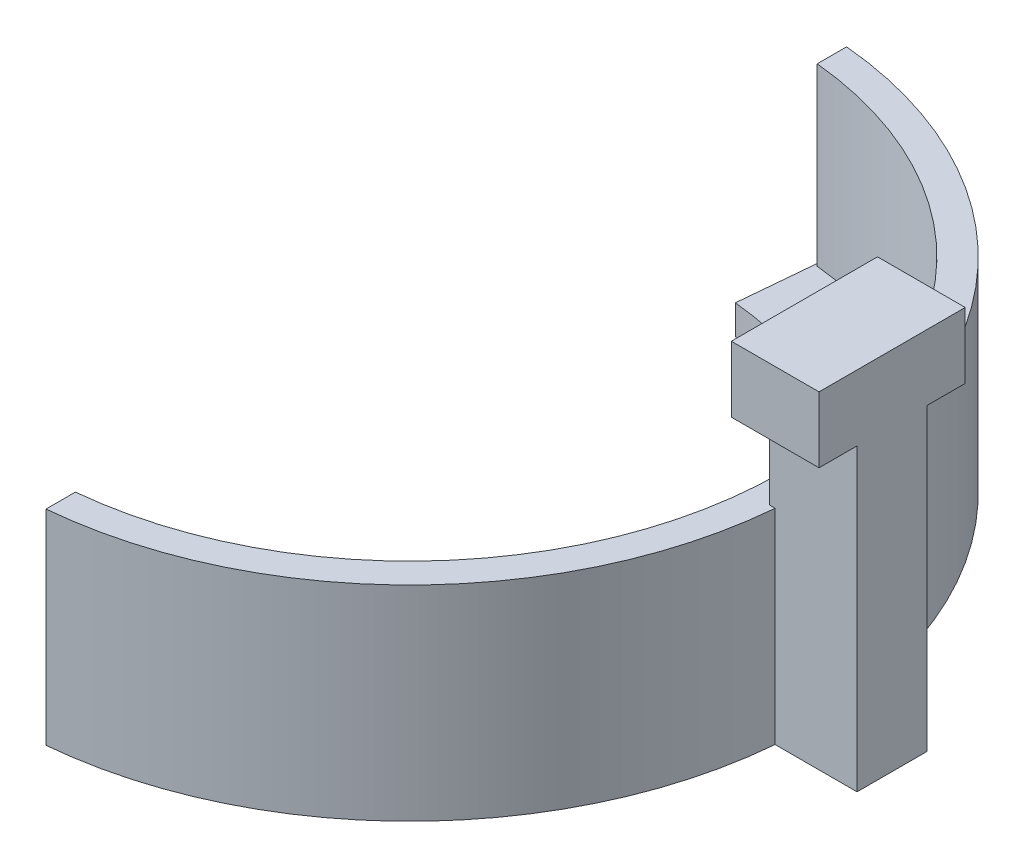
ISO-10303-21;
HEADER;
FILE_DESCRIPTION(('STEP AP214'),'2;1');
FILE_NAME('part.step','',(''),(''),'','','');
FILE_SCHEMA(('AUTOMOTIVE_DESIGN { 1 0 10303 214 1 1 1 1 }'));
ENDSEC;
DATA;
#1=APPLICATION_CONTEXT('core data for automotive mechanical design processes');
#2=APPLICATION_PROTOCOL_DEFINITION('international standard','automotive_design',2000,#1);
#3=PRODUCT_CONTEXT('',#1,'mechanical');
#4=PRODUCT('Part','Part','',(#3));
#5=PRODUCT_RELATED_PRODUCT_CATEGORY('part','',(#4));
#6=PRODUCT_DEFINITION_FORMATION('','',#4);
#7=PRODUCT_DEFINITION_CONTEXT('part definition',#1,'design');
#8=PRODUCT_DEFINITION('design','',#6,#7);
#9=PRODUCT_DEFINITION_SHAPE('','',#8);
#10=(LENGTH_UNIT() NAMED_UNIT(*) SI_UNIT(.MILLI.,.METRE.));
#11=(NAMED_UNIT(*) PLANE_ANGLE_UNIT() SI_UNIT($,.RADIAN.));
#12=(NAMED_UNIT(*) SI_UNIT($,.STERADIAN.) SOLID_ANGLE_UNIT());
#13=UNCERTAINTY_MEASURE_WITH_UNIT(LENGTH_MEASURE(1.E-05),#10,'distance_accuracy_value','');
#14=(GEOMETRIC_REPRESENTATION_CONTEXT(3) GLOBAL_UNCERTAINTY_ASSIGNED_CONTEXT((#13)) GLOBAL_UNIT_ASSIGNED_CONTEXT((#10,
#11,#12)) REPRESENTATION_CONTEXT('',''));
#15=CARTESIAN_POINT('',(0.,0.,0.));
#16=DIRECTION('',(0.,0.,1.));
#17=DIRECTION('',(1.,0.,0.));
#18=AXIS2_PLACEMENT_3D('',#15,#16,#17);
#19=CARTESIAN_POINT('',(27.,20.,-2.4));
#20=DIRECTION('',(0.,0.,-1.));
#21=DIRECTION('',(-1.,0.,0.));
#22=AXIS2_PLACEMENT_3D('',#19,#20,#21);
#23=PLANE('',#22);
#24=DIRECTION('',(0.,-1.,0.));
#25=VECTOR('',#24,1.);
#26=CARTESIAN_POINT('',(27.,20.,-2.4));
#27=LINE('',#26,#25);
#28=CARTESIAN_POINT('',(27.,18.5,-2.4));
#29=VERTEX_POINT('',#28);
#30=CARTESIAN_POINT('',(27.,12.,-2.4));
#31=VERTEX_POINT('',#30);
#32=EDGE_CURVE('E57',#29,#31,#27,.T.);
#33=ORIENTED_EDGE('',*,*,#32,.F.);
#34=DIRECTION('',(1.,0.,0.));
#35=VECTOR('',#34,1.);
#36=CARTESIAN_POINT('',(27.,18.5,-2.4));
#37=LINE('',#36,#35);
#38=CARTESIAN_POINT('',(33.,18.5,-2.4));
#39=VERTEX_POINT('',#38);
#40=EDGE_CURVE('E224',#29,#39,#37,.T.);
#41=ORIENTED_EDGE('',*,*,#40,.T.);
#42=DIRECTION('',(0.,-1.,0.));
#43=VECTOR('',#42,1.);
#44=CARTESIAN_POINT('',(33.,20.,-2.4));
#45=LINE('',#44,#43);
#46=CARTESIAN_POINT('',(33.,-2.,-2.4));
#47=VERTEX_POINT('',#46);
#48=EDGE_CURVE('E241',#39,#47,#45,.T.);
#49=ORIENTED_EDGE('',*,*,#48,.T.);
#50=DIRECTION('',(1.,0.,0.));
#51=VECTOR('',#50,1.);
#52=CARTESIAN_POINT('',(27.,-2.,-2.4));
#53=LINE('',#52,#51);
#54=CARTESIAN_POINT('',(27.3950725496393,-2.,-2.4));
#55=VERTEX_POINT('',#54);
#56=EDGE_CURVE('E236',#55,#47,#53,.T.);
#57=ORIENTED_EDGE('',*,*,#56,.F.);
#58=DIRECTION('',(0.,-1.,0.));
#59=VECTOR('',#58,1.);
#60=CARTESIAN_POINT('',(27.3950725496393,12.,-2.4));
#61=LINE('',#60,#59);
#62=CARTESIAN_POINT('',(27.3950725496393,12.,-2.4));
#63=VERTEX_POINT('',#62);
#64=EDGE_CURVE('E264',#63,#55,#61,.T.);
#65=ORIENTED_EDGE('',*,*,#64,.F.);
#66=DIRECTION('',(-1.,0.,0.));
#67=VECTOR('',#66,1.);
#68=CARTESIAN_POINT('',(0.,12.,-2.4));
#69=LINE('',#68,#67);
#70=EDGE_CURVE('E260',#63,#31,#69,.T.);
#71=ORIENTED_EDGE('',*,*,#70,.T.);
#72=EDGE_LOOP('',(#33,#41,#49,#57,#65,#71));
#73=FACE_BOUND('',#72,.T.);
#74=ADVANCED_FACE('F41',(#73),#23,.T.);
#75=CARTESIAN_POINT('',(27.,20.,2.4));
#76=DIRECTION('',(0.,0.,1.));
#77=DIRECTION('',(1.,0.,0.));
#78=AXIS2_PLACEMENT_3D('',#75,#76,#77);
#79=PLANE('',#78);
#80=DIRECTION('',(0.,-1.,0.));
#81=VECTOR('',#80,1.);
#82=CARTESIAN_POINT('',(33.,20.,2.4));
#83=LINE('',#82,#81);
#84=CARTESIAN_POINT('',(33.,18.5,2.4));
#85=VERTEX_POINT('',#84);
#86=CARTESIAN_POINT('',(33.,-2.,2.4));
#87=VERTEX_POINT('',#86);
#88=EDGE_CURVE('E240',#85,#87,#83,.T.);
#89=ORIENTED_EDGE('',*,*,#88,.F.);
#90=DIRECTION('',(-1.,0.,0.));
#91=VECTOR('',#90,1.);
#92=CARTESIAN_POINT('',(27.,18.5,2.4));
#93=LINE('',#92,#91);
#94=CARTESIAN_POINT('',(27.,18.5,2.4));
#95=VERTEX_POINT('',#94);
#96=EDGE_CURVE('E216',#85,#95,#93,.T.);
#97=ORIENTED_EDGE('',*,*,#96,.T.);
#98=DIRECTION('',(0.,-1.,0.));
#99=VECTOR('',#98,1.);
#100=CARTESIAN_POINT('',(27.,20.,2.4));
#101=LINE('',#100,#99);
#102=CARTESIAN_POINT('',(27.,12.,2.4));
#103=VERTEX_POINT('',#102);
#104=EDGE_CURVE('E65',#95,#103,#101,.T.);
#105=ORIENTED_EDGE('',*,*,#104,.T.);
#106=DIRECTION('',(1.,0.,0.));
#107=VECTOR('',#106,1.);
#108=CARTESIAN_POINT('',(0.,12.,2.4));
#109=LINE('',#108,#107);
#110=CARTESIAN_POINT('',(27.3950725496393,12.,2.4));
#111=VERTEX_POINT('',#110);
#112=EDGE_CURVE('E244',#103,#111,#109,.T.);
#113=ORIENTED_EDGE('',*,*,#112,.T.);
#114=DIRECTION('',(0.,-1.,0.));
#115=VECTOR('',#114,1.);
#116=CARTESIAN_POINT('',(27.3950725496393,12.,2.4));
#117=LINE('',#116,#115);
#118=CARTESIAN_POINT('',(27.3950725496393,-2.,2.4));
#119=VERTEX_POINT('',#118);
#120=EDGE_CURVE('E253',#119,#111,#117,.F.);
#121=ORIENTED_EDGE('',*,*,#120,.F.);
#122=DIRECTION('',(-1.,0.,0.));
#123=VECTOR('',#122,1.);
#124=CARTESIAN_POINT('',(27.,-2.,2.4));
#125=LINE('',#124,#123);
#126=EDGE_CURVE('E232',#87,#119,#125,.T.);
#127=ORIENTED_EDGE('',*,*,#126,.F.);
#128=EDGE_LOOP('',(#89,#97,#105,#113,#121,#127));
#129=FACE_BOUND('',#128,.T.);
#130=ADVANCED_FACE('F380',(#129),#79,.T.);
#131=CARTESIAN_POINT('',(0.,12.,0.));
#132=DIRECTION('',(0.,-1.,0.));
#133=DIRECTION('',(0.,0.,-1.));
#134=AXIS2_PLACEMENT_3D('',#131,#132,#133);
#135=CYLINDRICAL_SURFACE('',#134,27.5);
#136=CARTESIAN_POINT('',(0.,12.,0.));
#137=DIRECTION('',(0.,1.,0.));
#138=DIRECTION('',(0.,0.,1.));
#139=AXIS2_PLACEMENT_3D('',#136,#137,#138);
#140=CIRCLE('',#139,27.5);
#141=CARTESIAN_POINT('',(2.5,12.,-27.3861278752583));
#142=VERTEX_POINT('',#141);
#143=EDGE_CURVE('E313',#63,#142,#140,.T.);
#144=ORIENTED_EDGE('',*,*,#143,.F.);
#145=ORIENTED_EDGE('',*,*,#64,.T.);
#146=CARTESIAN_POINT('',(0.,-2.,0.));
#147=DIRECTION('',(0.,1.,0.));
#148=DIRECTION('',(0.,0.,-1.));
#149=AXIS2_PLACEMENT_3D('',#146,#147,#148);
#150=CIRCLE('',#149,27.5);
#151=CARTESIAN_POINT('',(2.5,-2.,-27.3861278752583));
#152=VERTEX_POINT('',#151);
#153=EDGE_CURVE('E272',#55,#152,#150,.T.);
#154=ORIENTED_EDGE('',*,*,#153,.T.);
#155=DIRECTION('',(0.,1.,0.));
#156=VECTOR('',#155,1.);
#157=CARTESIAN_POINT('',(2.5,-2.,-27.3861278752583));
#158=LINE('',#157,#156);
#159=CARTESIAN_POINT('',(2.5,0.,-27.3861278752583));
#160=VERTEX_POINT('',#159);
#161=EDGE_CURVE('E284',#152,#160,#158,.T.);
#162=ORIENTED_EDGE('',*,*,#161,.T.);
#163=DIRECTION('',(0.,-1.,0.));
#164=VECTOR('',#163,1.);
#165=CARTESIAN_POINT('',(2.5,12.,-27.3861278752583));
#166=LINE('',#165,#164);
#167=EDGE_CURVE('E11',#142,#160,#166,.T.);
#168=ORIENTED_EDGE('',*,*,#167,.F.);
#169=EDGE_LOOP('',(#144,#145,#154,#162,#168));
#170=FACE_BOUND('',#169,.T.);
#171=ADVANCED_FACE('F357',(#170),#135,.T.);
#172=CARTESIAN_POINT('',(2.5,-2.,27.3861278752583));
#173=VERTEX_POINT('',#172);
#174=EDGE_CURVE('E268',#173,#119,#150,.T.);
#175=ORIENTED_EDGE('',*,*,#174,.T.);
#176=ORIENTED_EDGE('',*,*,#120,.T.);
#177=CARTESIAN_POINT('',(2.5,12.,27.3861278752583));
#178=VERTEX_POINT('',#177);
#179=EDGE_CURVE('E309',#178,#111,#140,.T.);
#180=ORIENTED_EDGE('',*,*,#179,.F.);
#181=DIRECTION('',(0.,-1.,0.));
#182=VECTOR('',#181,1.);
#183=CARTESIAN_POINT('',(2.5,12.,27.3861278752583));
#184=LINE('',#183,#182);
#185=CARTESIAN_POINT('',(2.5,0.,27.3861278752583));
#186=VERTEX_POINT('',#185);
#187=EDGE_CURVE('E322',#178,#186,#184,.T.);
#188=ORIENTED_EDGE('',*,*,#187,.T.);
#189=DIRECTION('',(0.,1.,0.));
#190=VECTOR('',#189,1.);
#191=CARTESIAN_POINT('',(2.5,-2.,27.3861278752583));
#192=LINE('',#191,#190);
#193=EDGE_CURVE('E296',#173,#186,#192,.T.);
#194=ORIENTED_EDGE('',*,*,#193,.F.);
#195=EDGE_LOOP('',(#175,#176,#180,#188,#194));
#196=FACE_BOUND('',#195,.T.);
#197=ADVANCED_FACE('F43',(#196),#135,.T.);
#198=CARTESIAN_POINT('',(2.5,12.,-27.3861278752583));
#199=DIRECTION('',(1.,0.,0.));
#200=DIRECTION('',(0.,0.,-1.));
#201=AXIS2_PLACEMENT_3D('',#198,#199,#200);
#202=PLANE('',#201);
#203=DIRECTION('',(0.,0.,1.));
#204=VECTOR('',#203,1.);
#205=CARTESIAN_POINT('',(2.5,0.,-27.3861278752583));
#206=LINE('',#205,#204);
#207=CARTESIAN_POINT('',(2.5,0.,-25.377155080899));
#208=VERTEX_POINT('',#207);
#209=EDGE_CURVE('E299',#160,#208,#206,.T.);
#210=ORIENTED_EDGE('',*,*,#209,.T.);
#211=DIRECTION('',(0.,-1.,0.));
#212=VECTOR('',#211,1.);
#213=CARTESIAN_POINT('',(2.5,12.,-25.377155080899));
#214=LINE('',#213,#212);
#215=CARTESIAN_POINT('',(2.5,12.,-25.377155080899));
#216=VERTEX_POINT('',#215);
#217=EDGE_CURVE('E50',#216,#208,#214,.T.);
#218=ORIENTED_EDGE('',*,*,#217,.F.);
#219=DIRECTION('',(0.,0.,1.));
#220=VECTOR('',#219,1.);
#221=CARTESIAN_POINT('',(2.5,12.,-27.3861278752583));
#222=LINE('',#221,#220);
#223=EDGE_CURVE('E312',#142,#216,#222,.T.);
#224=ORIENTED_EDGE('',*,*,#223,.F.);
#225=ORIENTED_EDGE('',*,*,#167,.T.);
#226=EDGE_LOOP('',(#210,#218,#224,#225));
#227=FACE_BOUND('',#226,.T.);
#228=ADVANCED_FACE('F349',(#227),#202,.F.);
#229=CARTESIAN_POINT('',(0.,12.,0.));
#230=DIRECTION('',(0.,-1.,0.));
#231=DIRECTION('',(0.,0.,-1.));
#232=AXIS2_PLACEMENT_3D('',#229,#230,#231);
#233=CYLINDRICAL_SURFACE('',#232,25.5);
#234=CARTESIAN_POINT('',(0.,0.,0.));
#235=DIRECTION('',(0.,-1.,0.));
#236=DIRECTION('',(0.,0.,1.));
#237=AXIS2_PLACEMENT_3D('',#234,#235,#236);
#238=CIRCLE('',#237,25.5);
#239=CARTESIAN_POINT('',(2.5,0.,25.377155080899));
#240=VERTEX_POINT('',#239);
#241=EDGE_CURVE('E326',#208,#240,#238,.T.);
#242=ORIENTED_EDGE('',*,*,#241,.T.);
#243=DIRECTION('',(0.,-1.,0.));
#244=VECTOR('',#243,1.);
#245=CARTESIAN_POINT('',(2.5,12.,25.377155080899));
#246=LINE('',#245,#244);
#247=CARTESIAN_POINT('',(2.5,12.,25.377155080899));
#248=VERTEX_POINT('',#247);
#249=EDGE_CURVE('E337',#248,#240,#246,.T.);
#250=ORIENTED_EDGE('',*,*,#249,.F.);
#251=CARTESIAN_POINT('',(0.,12.,0.));
#252=DIRECTION('',(0.,-1.,0.));
#253=DIRECTION('',(0.,0.,1.));
#254=AXIS2_PLACEMENT_3D('',#251,#252,#253);
#255=CIRCLE('',#254,25.5);
#256=EDGE_CURVE('E316',#216,#248,#255,.T.);
#257=ORIENTED_EDGE('',*,*,#256,.F.);
#258=ORIENTED_EDGE('',*,*,#217,.T.);
#259=EDGE_LOOP('',(#242,#250,#257,#258));
#260=FACE_BOUND('',#259,.T.);
#261=ADVANCED_FACE('F345',(#260),#233,.F.);
#262=CARTESIAN_POINT('',(2.5,12.,25.377155080899));
#263=DIRECTION('',(1.,0.,0.));
#264=DIRECTION('',(0.,0.,-1.));
#265=AXIS2_PLACEMENT_3D('',#262,#263,#264);
#266=PLANE('',#265);
#267=DIRECTION('',(0.,0.,1.));
#268=VECTOR('',#267,1.);
#269=CARTESIAN_POINT('',(2.5,0.,25.377155080899));
#270=LINE('',#269,#268);
#271=EDGE_CURVE('E330',#240,#186,#270,.T.);
#272=ORIENTED_EDGE('',*,*,#271,.T.);
#273=ORIENTED_EDGE('',*,*,#187,.F.);
#274=DIRECTION('',(0.,0.,1.));
#275=VECTOR('',#274,1.);
#276=CARTESIAN_POINT('',(2.5,12.,25.377155080899));
#277=LINE('',#276,#275);
#278=EDGE_CURVE('E319',#248,#178,#277,.T.);
#279=ORIENTED_EDGE('',*,*,#278,.F.);
#280=ORIENTED_EDGE('',*,*,#249,.T.);
#281=EDGE_LOOP('',(#272,#273,#279,#280));
#282=FACE_BOUND('',#281,.T.);
#283=ADVANCED_FACE('F385',(#282),#266,.F.);
#284=CARTESIAN_POINT('',(0.,12.,0.));
#285=DIRECTION('',(0.,1.,0.));
#286=DIRECTION('',(0.,0.,1.));
#287=AXIS2_PLACEMENT_3D('',#284,#285,#286);
#288=PLANE('',#287);
#289=ORIENTED_EDGE('',*,*,#70,.F.);
#290=ORIENTED_EDGE('',*,*,#143,.T.);
#291=ORIENTED_EDGE('',*,*,#223,.T.);
#292=ORIENTED_EDGE('',*,*,#256,.T.);
#293=ORIENTED_EDGE('',*,*,#278,.T.);
#294=ORIENTED_EDGE('',*,*,#179,.T.);
#295=ORIENTED_EDGE('',*,*,#112,.F.);
#296=DIRECTION('',(0.,0.,1.));
#297=VECTOR('',#296,1.);
#298=CARTESIAN_POINT('',(27.,12.,0.));
#299=LINE('',#298,#297);
#300=EDGE_CURVE('E257',#31,#103,#299,.T.);
#301=ORIENTED_EDGE('',*,*,#300,.F.);
#302=EDGE_LOOP('',(#289,#290,#291,#292,#293,#294,#295,#301));
#303=FACE_BOUND('',#302,.T.);
#304=ADVANCED_FACE('F382',(#303),#288,.T.);
#305=CARTESIAN_POINT('',(2.5,-2.,27.3861278752583));
#306=DIRECTION('',(-0.995859195463938,0.,0.0909090909090909));
#307=DIRECTION('',(0.0909090909090909,0.,0.995859195463938));
#308=AXIS2_PLACEMENT_3D('',#305,#306,#307);
#309=PLANE('',#308);
#310=DIRECTION('',(0.0909090909090909,0.,0.995859195463938));
#311=VECTOR('',#310,1.);
#312=CARTESIAN_POINT('',(2.5,0.,27.3861278752583));
#313=LINE('',#312,#311);
#314=CARTESIAN_POINT('',(1.86363636363636,0.,20.4151135070107));
#315=VERTEX_POINT('',#314);
#316=EDGE_CURVE('E292',#315,#186,#313,.T.);
#317=ORIENTED_EDGE('',*,*,#316,.F.);
#318=DIRECTION('',(0.,1.,0.));
#319=VECTOR('',#318,1.);
#320=CARTESIAN_POINT('',(1.86363636363636,-2.,20.4151135070107));
#321=LINE('',#320,#319);
#322=CARTESIAN_POINT('',(1.86363636363636,-2.,20.4151135070107));
#323=VERTEX_POINT('',#322);
#324=EDGE_CURVE('E300',#323,#315,#321,.T.);
#325=ORIENTED_EDGE('',*,*,#324,.F.);
#326=DIRECTION('',(0.0909090909090909,0.,0.995859195463938));
#327=VECTOR('',#326,1.);
#328=CARTESIAN_POINT('',(2.5,-2.,27.3861278752583));
#329=LINE('',#328,#327);
#330=EDGE_CURVE('E280',#323,#173,#329,.T.);
#331=ORIENTED_EDGE('',*,*,#330,.T.);
#332=ORIENTED_EDGE('',*,*,#193,.T.);
#333=EDGE_LOOP('',(#317,#325,#331,#332));
#334=FACE_BOUND('',#333,.T.);
#335=ADVANCED_FACE('F368',(#334),#309,.T.);
#336=CARTESIAN_POINT('',(0.,-2.,0.));
#337=DIRECTION('',(0.,1.,0.));
#338=DIRECTION('',(0.,0.,1.));
#339=AXIS2_PLACEMENT_3D('',#336,#337,#338);
#340=CYLINDRICAL_SURFACE('',#339,20.5);
#341=CARTESIAN_POINT('',(0.,0.,0.));
#342=DIRECTION('',(0.,-1.,0.));
#343=DIRECTION('',(0.,0.,-1.));
#344=AXIS2_PLACEMENT_3D('',#341,#342,#343);
#345=CIRCLE('',#344,20.5);
#346=CARTESIAN_POINT('',(1.86363636363637,0.,-20.4151135070107));
#347=VERTEX_POINT('',#346);
#348=EDGE_CURVE('E288',#347,#315,#345,.T.);
#349=ORIENTED_EDGE('',*,*,#348,.F.);
#350=DIRECTION('',(0.,1.,0.));
#351=VECTOR('',#350,1.);
#352=CARTESIAN_POINT('',(1.86363636363637,-2.,-20.4151135070107));
#353=LINE('',#352,#351);
#354=CARTESIAN_POINT('',(1.86363636363637,-2.,-20.4151135070107));
#355=VERTEX_POINT('',#354);
#356=EDGE_CURVE('E303',#355,#347,#353,.T.);
#357=ORIENTED_EDGE('',*,*,#356,.F.);
#358=CARTESIAN_POINT('',(0.,-2.,0.));
#359=DIRECTION('',(0.,-1.,0.));
#360=DIRECTION('',(0.,0.,-1.));
#361=AXIS2_PLACEMENT_3D('',#358,#359,#360);
#362=CIRCLE('',#361,20.5);
#363=EDGE_CURVE('E276',#355,#323,#362,.T.);
#364=ORIENTED_EDGE('',*,*,#363,.T.);
#365=ORIENTED_EDGE('',*,*,#324,.T.);
#366=EDGE_LOOP('',(#349,#357,#364,#365));
#367=FACE_BOUND('',#366,.T.);
#368=ADVANCED_FACE('F365',(#367),#340,.F.);
#369=CARTESIAN_POINT('',(2.5,-2.,-27.3861278752583));
#370=DIRECTION('',(-0.995859195463939,0.,-0.0909090909090895));
#371=DIRECTION('',(-0.0909090909090895,0.,0.995859195463939));
#372=AXIS2_PLACEMENT_3D('',#369,#370,#371);
#373=PLANE('',#372);
#374=DIRECTION('',(-0.0909090909090895,0.,0.995859195463939));
#375=VECTOR('',#374,1.);
#376=CARTESIAN_POINT('',(2.5,0.,-27.3861278752583));
#377=LINE('',#376,#375);
#378=EDGE_CURVE('E267',#160,#347,#377,.T.);
#379=ORIENTED_EDGE('',*,*,#378,.F.);
#380=ORIENTED_EDGE('',*,*,#161,.F.);
#381=DIRECTION('',(-0.0909090909090895,0.,0.995859195463939));
#382=VECTOR('',#381,1.);
#383=CARTESIAN_POINT('',(2.5,-2.,-27.3861278752583));
#384=LINE('',#383,#382);
#385=EDGE_CURVE('E271',#152,#355,#384,.T.);
#386=ORIENTED_EDGE('',*,*,#385,.T.);
#387=ORIENTED_EDGE('',*,*,#356,.T.);
#388=EDGE_LOOP('',(#379,#380,#386,#387));
#389=FACE_BOUND('',#388,.T.);
#390=ADVANCED_FACE('F361',(#389),#373,.T.);
#391=CARTESIAN_POINT('',(0.,-2.,0.));
#392=DIRECTION('',(0.,-1.,0.));
#393=DIRECTION('',(0.,0.,-1.));
#394=AXIS2_PLACEMENT_3D('',#391,#392,#393);
#395=PLANE('',#394);
#396=ORIENTED_EDGE('',*,*,#153,.F.);
#397=ORIENTED_EDGE('',*,*,#56,.T.);
#398=DIRECTION('',(0.,0.,1.));
#399=VECTOR('',#398,1.);
#400=CARTESIAN_POINT('',(33.,-2.,-2.4));
#401=LINE('',#400,#399);
#402=EDGE_CURVE('E228',#47,#87,#401,.T.);
#403=ORIENTED_EDGE('',*,*,#402,.T.);
#404=ORIENTED_EDGE('',*,*,#126,.T.);
#405=ORIENTED_EDGE('',*,*,#174,.F.);
#406=ORIENTED_EDGE('',*,*,#330,.F.);
#407=ORIENTED_EDGE('',*,*,#363,.F.);
#408=ORIENTED_EDGE('',*,*,#385,.F.);
#409=EDGE_LOOP('',(#396,#397,#403,#404,#405,#406,#407,#408));
#410=FACE_BOUND('',#409,.T.);
#411=ADVANCED_FACE('F376',(#410),#395,.T.);
#412=CARTESIAN_POINT('',(0.,0.,0.));
#413=DIRECTION('',(0.,-1.,0.));
#414=DIRECTION('',(0.,0.,-1.));
#415=AXIS2_PLACEMENT_3D('',#412,#413,#414);
#416=PLANE('',#415);
#417=ORIENTED_EDGE('',*,*,#271,.F.);
#418=ORIENTED_EDGE('',*,*,#241,.F.);
#419=ORIENTED_EDGE('',*,*,#209,.F.);
#420=ORIENTED_EDGE('',*,*,#378,.T.);
#421=ORIENTED_EDGE('',*,*,#348,.T.);
#422=ORIENTED_EDGE('',*,*,#316,.T.);
#423=EDGE_LOOP('',(#417,#418,#419,#420,#421,#422));
#424=FACE_BOUND('',#423,.T.);
#425=ADVANCED_FACE('F352',(#424),#416,.F.);
#426=CARTESIAN_POINT('',(33.,20.,-2.4));
#427=DIRECTION('',(1.,0.,0.));
#428=DIRECTION('',(0.,0.,-1.));
#429=AXIS2_PLACEMENT_3D('',#426,#427,#428);
#430=PLANE('',#429);
#431=ORIENTED_EDGE('',*,*,#48,.F.);
#432=DIRECTION('',(0.,0.,-1.));
#433=VECTOR('',#432,1.);
#434=CARTESIAN_POINT('',(33.,18.5,-5.));
#435=LINE('',#434,#433);
#436=CARTESIAN_POINT('',(33.,18.5,-5.));
#437=VERTEX_POINT('',#436);
#438=EDGE_CURVE('E171',#39,#437,#435,.T.);
#439=ORIENTED_EDGE('',*,*,#438,.T.);
#440=DIRECTION('',(0.,1.,0.));
#441=VECTOR('',#440,1.);
#442=CARTESIAN_POINT('',(33.,18.5,-5.));
#443=LINE('',#442,#441);
#444=CARTESIAN_POINT('',(33.,23.,-5.));
#445=VERTEX_POINT('',#444);
#446=EDGE_CURVE('E165',#437,#445,#443,.T.);
#447=ORIENTED_EDGE('',*,*,#446,.T.);
#448=DIRECTION('',(0.,0.,-1.));
#449=VECTOR('',#448,1.);
#450=CARTESIAN_POINT('',(33.,23.,-5.));
#451=LINE('',#450,#449);
#452=CARTESIAN_POINT('',(33.,23.,5.));
#453=VERTEX_POINT('',#452);
#454=EDGE_CURVE('E170',#453,#445,#451,.T.);
#455=ORIENTED_EDGE('',*,*,#454,.F.);
#456=DIRECTION('',(0.,1.,0.));
#457=VECTOR('',#456,1.);
#458=CARTESIAN_POINT('',(33.,18.5,5.));
#459=LINE('',#458,#457);
#460=CARTESIAN_POINT('',(33.,18.5,5.));
#461=VERTEX_POINT('',#460);
#462=EDGE_CURVE('E213',#461,#453,#459,.T.);
#463=ORIENTED_EDGE('',*,*,#462,.F.);
#464=EDGE_CURVE('E199',#461,#85,#435,.T.);
#465=ORIENTED_EDGE('',*,*,#464,.T.);
#466=ORIENTED_EDGE('',*,*,#88,.T.);
#467=ORIENTED_EDGE('',*,*,#402,.F.);
#468=EDGE_LOOP('',(#431,#439,#447,#455,#463,#465,#466,#467));
#469=FACE_BOUND('',#468,.T.);
#470=ADVANCED_FACE('F168',(#469),#430,.T.);
#471=CARTESIAN_POINT('',(27.,20.,-2.4));
#472=DIRECTION('',(-1.,0.,0.));
#473=DIRECTION('',(0.,0.,1.));
#474=AXIS2_PLACEMENT_3D('',#471,#472,#473);
#475=PLANE('',#474);
#476=DIRECTION('',(0.,0.,1.));
#477=VECTOR('',#476,1.);
#478=CARTESIAN_POINT('',(27.,18.5,-5.));
#479=LINE('',#478,#477);
#480=CARTESIAN_POINT('',(27.,18.5,-5.));
#481=VERTEX_POINT('',#480);
#482=EDGE_CURVE('E207',#481,#29,#479,.T.);
#483=ORIENTED_EDGE('',*,*,#482,.T.);
#484=ORIENTED_EDGE('',*,*,#32,.T.);
#485=ORIENTED_EDGE('',*,*,#300,.T.);
#486=ORIENTED_EDGE('',*,*,#104,.F.);
#487=CARTESIAN_POINT('',(27.,18.5,5.));
#488=VERTEX_POINT('',#487);
#489=EDGE_CURVE('E206',#95,#488,#479,.T.);
#490=ORIENTED_EDGE('',*,*,#489,.T.);
#491=DIRECTION('',(0.,1.,0.));
#492=VECTOR('',#491,1.);
#493=CARTESIAN_POINT('',(27.,18.5,5.));
#494=LINE('',#493,#492);
#495=CARTESIAN_POINT('',(27.,23.,5.));
#496=VERTEX_POINT('',#495);
#497=EDGE_CURVE('E217',#488,#496,#494,.T.);
#498=ORIENTED_EDGE('',*,*,#497,.T.);
#499=DIRECTION('',(0.,0.,1.));
#500=VECTOR('',#499,1.);
#501=CARTESIAN_POINT('',(27.,23.,-5.));
#502=LINE('',#501,#500);
#503=CARTESIAN_POINT('',(27.,23.,-5.));
#504=VERTEX_POINT('',#503);
#505=EDGE_CURVE('E186',#504,#496,#502,.T.);
#506=ORIENTED_EDGE('',*,*,#505,.F.);
#507=DIRECTION('',(0.,1.,0.));
#508=VECTOR('',#507,1.);
#509=CARTESIAN_POINT('',(27.,18.5,-5.));
#510=LINE('',#509,#508);
#511=EDGE_CURVE('E176',#481,#504,#510,.T.);
#512=ORIENTED_EDGE('',*,*,#511,.F.);
#513=EDGE_LOOP('',(#483,#484,#485,#486,#490,#498,#506,#512));
#514=FACE_BOUND('',#513,.T.);
#515=ADVANCED_FACE('F404',(#514),#475,.T.);
#516=CARTESIAN_POINT('',(0.,18.5,0.));
#517=DIRECTION('',(0.,1.,0.));
#518=DIRECTION('',(0.,0.,1.));
#519=AXIS2_PLACEMENT_3D('',#516,#517,#518);
#520=PLANE('',#519);
#521=ORIENTED_EDGE('',*,*,#40,.F.);
#522=ORIENTED_EDGE('',*,*,#482,.F.);
#523=DIRECTION('',(-1.,0.,0.));
#524=VECTOR('',#523,1.);
#525=CARTESIAN_POINT('',(27.,18.5,-5.));
#526=LINE('',#525,#524);
#527=EDGE_CURVE('E203',#437,#481,#526,.T.);
#528=ORIENTED_EDGE('',*,*,#527,.F.);
#529=ORIENTED_EDGE('',*,*,#438,.F.);
#530=EDGE_LOOP('',(#521,#522,#528,#529));
#531=FACE_BOUND('',#530,.T.);
#532=ADVANCED_FACE('F406',(#531),#520,.F.);
#533=CARTESIAN_POINT('',(27.,18.5,5.));
#534=DIRECTION('',(0.,0.,1.));
#535=DIRECTION('',(1.,0.,0.));
#536=AXIS2_PLACEMENT_3D('',#533,#534,#535);
#537=PLANE('',#536);
#538=ORIENTED_EDGE('',*,*,#462,.T.);
#539=DIRECTION('',(1.,0.,0.));
#540=VECTOR('',#539,1.);
#541=CARTESIAN_POINT('',(27.,23.,5.));
#542=LINE('',#541,#540);
#543=EDGE_CURVE('E191',#496,#453,#542,.T.);
#544=ORIENTED_EDGE('',*,*,#543,.F.);
#545=ORIENTED_EDGE('',*,*,#497,.F.);
#546=DIRECTION('',(1.,0.,0.));
#547=VECTOR('',#546,1.);
#548=CARTESIAN_POINT('',(27.,18.5,5.));
#549=LINE('',#548,#547);
#550=EDGE_CURVE('E177',#488,#461,#549,.T.);
#551=ORIENTED_EDGE('',*,*,#550,.T.);
#552=EDGE_LOOP('',(#538,#544,#545,#551));
#553=FACE_BOUND('',#552,.T.);
#554=ADVANCED_FACE('F448',(#553),#537,.T.);
#555=CARTESIAN_POINT('',(27.,18.5,-5.));
#556=DIRECTION('',(0.,0.,-1.));
#557=DIRECTION('',(-1.,0.,0.));
#558=AXIS2_PLACEMENT_3D('',#555,#556,#557);
#559=PLANE('',#558);
#560=ORIENTED_EDGE('',*,*,#511,.T.);
#561=DIRECTION('',(-1.,0.,0.));
#562=VECTOR('',#561,1.);
#563=CARTESIAN_POINT('',(27.,23.,-5.));
#564=LINE('',#563,#562);
#565=EDGE_CURVE('E180',#445,#504,#564,.T.);
#566=ORIENTED_EDGE('',*,*,#565,.F.);
#567=ORIENTED_EDGE('',*,*,#446,.F.);
#568=ORIENTED_EDGE('',*,*,#527,.T.);
#569=EDGE_LOOP('',(#560,#566,#567,#568));
#570=FACE_BOUND('',#569,.T.);
#571=ADVANCED_FACE('F181',(#570),#559,.T.);
#572=ORIENTED_EDGE('',*,*,#96,.F.);
#573=ORIENTED_EDGE('',*,*,#464,.F.);
#574=ORIENTED_EDGE('',*,*,#550,.F.);
#575=ORIENTED_EDGE('',*,*,#489,.F.);
#576=EDGE_LOOP('',(#572,#573,#574,#575));
#577=FACE_BOUND('',#576,.T.);
#578=ADVANCED_FACE('F451',(#577),#520,.F.);
#579=CARTESIAN_POINT('',(0.,23.,0.));
#580=DIRECTION('',(0.,1.,0.));
#581=DIRECTION('',(0.,0.,1.));
#582=AXIS2_PLACEMENT_3D('',#579,#580,#581);
#583=PLANE('',#582);
#584=ORIENTED_EDGE('',*,*,#454,.T.);
#585=ORIENTED_EDGE('',*,*,#565,.T.);
#586=ORIENTED_EDGE('',*,*,#505,.T.);
#587=ORIENTED_EDGE('',*,*,#543,.T.);
#588=EDGE_LOOP('',(#584,#585,#586,#587));
#589=FACE_BOUND('',#588,.T.);
#590=ADVANCED_FACE('F189',(#589),#583,.T.);
#591=CLOSED_SHELL('',(#74,#130,#171,#197,#228,#261,#283,#304,#335,#368,#390,#411,#425,#470,#515,
#532,#554,#571,#578,#590));
#592=MANIFOLD_SOLID_BREP('B2',#591);
#593=ADVANCED_BREP_SHAPE_REPRESENTATION('',(#18,#592),#14);
#594=SHAPE_DEFINITION_REPRESENTATION(#9,#593);
ENDSEC;
END-ISO-10303-21;
